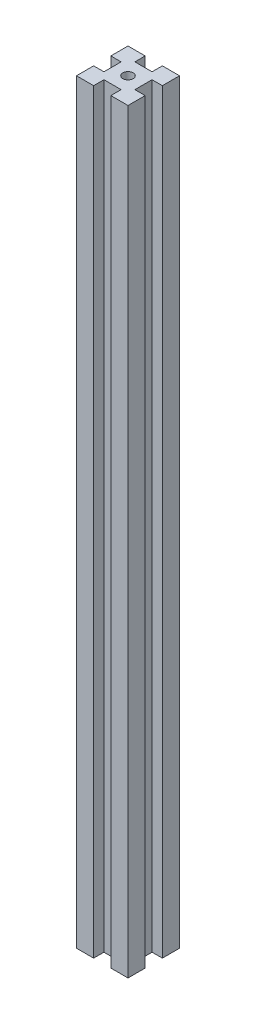
ISO-10303-21;
HEADER;
FILE_DESCRIPTION(('STEP AP214'),'2;1');
FILE_NAME('part.step','',(''),(''),'','','');
FILE_SCHEMA(('AUTOMOTIVE_DESIGN { 1 0 10303 214 1 1 1 1 }'));
ENDSEC;
DATA;
#1=APPLICATION_CONTEXT('core data for automotive mechanical design processes');
#2=APPLICATION_PROTOCOL_DEFINITION('international standard','automotive_design',2000,#1);
#3=PRODUCT_CONTEXT('',#1,'mechanical');
#4=PRODUCT('Part','Part','',(#3));
#5=PRODUCT_RELATED_PRODUCT_CATEGORY('part','',(#4));
#6=PRODUCT_DEFINITION_FORMATION('','',#4);
#7=PRODUCT_DEFINITION_CONTEXT('part definition',#1,'design');
#8=PRODUCT_DEFINITION('design','',#6,#7);
#9=PRODUCT_DEFINITION_SHAPE('','',#8);
#10=(LENGTH_UNIT() NAMED_UNIT(*) SI_UNIT(.MILLI.,.METRE.));
#11=(NAMED_UNIT(*) PLANE_ANGLE_UNIT() SI_UNIT($,.RADIAN.));
#12=(NAMED_UNIT(*) SI_UNIT($,.STERADIAN.) SOLID_ANGLE_UNIT());
#13=UNCERTAINTY_MEASURE_WITH_UNIT(LENGTH_MEASURE(1.E-05),#10,'distance_accuracy_value','');
#14=(GEOMETRIC_REPRESENTATION_CONTEXT(3) GLOBAL_UNCERTAINTY_ASSIGNED_CONTEXT((#13)) GLOBAL_UNIT_ASSIGNED_CONTEXT((#10,
#11,#12)) REPRESENTATION_CONTEXT('',''));
#15=CARTESIAN_POINT('',(0.,0.,0.));
#16=DIRECTION('',(0.,0.,1.));
#17=DIRECTION('',(1.,0.,0.));
#18=AXIS2_PLACEMENT_3D('',#15,#16,#17);
#19=CARTESIAN_POINT('',(0.,220.,0.));
#20=DIRECTION('',(0.,1.,0.));
#21=DIRECTION('',(0.,0.,1.));
#22=AXIS2_PLACEMENT_3D('',#19,#20,#21);
#23=PLANE('',#22);
#24=DIRECTION('',(-1.,0.,0.));
#25=VECTOR('',#24,1.);
#26=CARTESIAN_POINT('',(2.50000000000001,220.,-7.5));
#27=LINE('',#26,#25);
#28=CARTESIAN_POINT('',(7.5,220.,-7.5));
#29=VERTEX_POINT('',#28);
#30=CARTESIAN_POINT('',(2.50000000000001,220.,-7.5));
#31=VERTEX_POINT('',#30);
#32=EDGE_CURVE('E272',#29,#31,#27,.T.);
#33=ORIENTED_EDGE('',*,*,#32,.T.);
#34=DIRECTION('',(0.,0.,1.));
#35=VECTOR('',#34,1.);
#36=CARTESIAN_POINT('',(2.50000000000001,220.,-4.5));
#37=LINE('',#36,#35);
#38=CARTESIAN_POINT('',(2.50000000000001,220.,-4.5));
#39=VERTEX_POINT('',#38);
#40=EDGE_CURVE('E136',#31,#39,#37,.T.);
#41=ORIENTED_EDGE('',*,*,#40,.T.);
#42=DIRECTION('',(-1.,0.,0.));
#43=VECTOR('',#42,1.);
#44=CARTESIAN_POINT('',(-2.5,220.,-4.5));
#45=LINE('',#44,#43);
#46=CARTESIAN_POINT('',(-2.5,220.,-4.5));
#47=VERTEX_POINT('',#46);
#48=EDGE_CURVE('E341',#39,#47,#45,.T.);
#49=ORIENTED_EDGE('',*,*,#48,.T.);
#50=DIRECTION('',(0.,0.,-1.));
#51=VECTOR('',#50,1.);
#52=CARTESIAN_POINT('',(-2.5,220.,-7.5));
#53=LINE('',#52,#51);
#54=CARTESIAN_POINT('',(-2.5,220.,-7.5));
#55=VERTEX_POINT('',#54);
#56=EDGE_CURVE('E361',#47,#55,#53,.T.);
#57=ORIENTED_EDGE('',*,*,#56,.T.);
#58=DIRECTION('',(-1.,0.,0.));
#59=VECTOR('',#58,1.);
#60=CARTESIAN_POINT('',(-7.5,220.,-7.5));
#61=LINE('',#60,#59);
#62=CARTESIAN_POINT('',(-7.5,220.,-7.5));
#63=VERTEX_POINT('',#62);
#64=EDGE_CURVE('E357',#55,#63,#61,.T.);
#65=ORIENTED_EDGE('',*,*,#64,.T.);
#66=DIRECTION('',(0.,0.,1.));
#67=VECTOR('',#66,1.);
#68=CARTESIAN_POINT('',(-7.5,220.,-2.5));
#69=LINE('',#68,#67);
#70=CARTESIAN_POINT('',(-7.5,220.,-2.5));
#71=VERTEX_POINT('',#70);
#72=EDGE_CURVE('E360',#63,#71,#69,.T.);
#73=ORIENTED_EDGE('',*,*,#72,.T.);
#74=DIRECTION('',(1.,0.,0.));
#75=VECTOR('',#74,1.);
#76=CARTESIAN_POINT('',(-7.5,220.,-2.5));
#77=LINE('',#76,#75);
#78=CARTESIAN_POINT('',(-4.5,220.,-2.5));
#79=VERTEX_POINT('',#78);
#80=EDGE_CURVE('E365',#71,#79,#77,.T.);
#81=ORIENTED_EDGE('',*,*,#80,.T.);
#82=DIRECTION('',(0.,0.,1.));
#83=VECTOR('',#82,1.);
#84=CARTESIAN_POINT('',(-4.5,220.,-2.5));
#85=LINE('',#84,#83);
#86=CARTESIAN_POINT('',(-4.5,220.,2.5));
#87=VERTEX_POINT('',#86);
#88=EDGE_CURVE('E372',#79,#87,#85,.T.);
#89=ORIENTED_EDGE('',*,*,#88,.T.);
#90=DIRECTION('',(-1.,0.,0.));
#91=VECTOR('',#90,1.);
#92=CARTESIAN_POINT('',(-4.5,220.,2.5));
#93=LINE('',#92,#91);
#94=CARTESIAN_POINT('',(-7.5,220.,2.5));
#95=VERTEX_POINT('',#94);
#96=EDGE_CURVE('E375',#87,#95,#93,.T.);
#97=ORIENTED_EDGE('',*,*,#96,.T.);
#98=DIRECTION('',(0.,0.,1.));
#99=VECTOR('',#98,1.);
#100=CARTESIAN_POINT('',(-7.5,220.,7.5));
#101=LINE('',#100,#99);
#102=CARTESIAN_POINT('',(-7.5,220.,7.5));
#103=VERTEX_POINT('',#102);
#104=EDGE_CURVE('E378',#95,#103,#101,.T.);
#105=ORIENTED_EDGE('',*,*,#104,.T.);
#106=DIRECTION('',(1.,0.,0.));
#107=VECTOR('',#106,1.);
#108=CARTESIAN_POINT('',(-7.5,220.,7.5));
#109=LINE('',#108,#107);
#110=CARTESIAN_POINT('',(-2.5,220.,7.5));
#111=VERTEX_POINT('',#110);
#112=EDGE_CURVE('E381',#103,#111,#109,.T.);
#113=ORIENTED_EDGE('',*,*,#112,.T.);
#114=DIRECTION('',(0.,0.,-1.));
#115=VECTOR('',#114,1.);
#116=CARTESIAN_POINT('',(-2.5,220.,7.5));
#117=LINE('',#116,#115);
#118=CARTESIAN_POINT('',(-2.5,220.,4.5));
#119=VERTEX_POINT('',#118);
#120=EDGE_CURVE('E384',#111,#119,#117,.T.);
#121=ORIENTED_EDGE('',*,*,#120,.T.);
#122=DIRECTION('',(1.,0.,0.));
#123=VECTOR('',#122,1.);
#124=CARTESIAN_POINT('',(-2.5,220.,4.5));
#125=LINE('',#124,#123);
#126=CARTESIAN_POINT('',(2.5,220.,4.5));
#127=VERTEX_POINT('',#126);
#128=EDGE_CURVE('E387',#119,#127,#125,.T.);
#129=ORIENTED_EDGE('',*,*,#128,.T.);
#130=DIRECTION('',(0.,0.,1.));
#131=VECTOR('',#130,1.);
#132=CARTESIAN_POINT('',(2.5,220.,4.5));
#133=LINE('',#132,#131);
#134=CARTESIAN_POINT('',(2.5,220.,7.5));
#135=VERTEX_POINT('',#134);
#136=EDGE_CURVE('E390',#127,#135,#133,.T.);
#137=ORIENTED_EDGE('',*,*,#136,.T.);
#138=DIRECTION('',(1.,0.,0.));
#139=VECTOR('',#138,1.);
#140=CARTESIAN_POINT('',(2.5,220.,7.5));
#141=LINE('',#140,#139);
#142=CARTESIAN_POINT('',(7.5,220.,7.5));
#143=VERTEX_POINT('',#142);
#144=EDGE_CURVE('E393',#135,#143,#141,.T.);
#145=ORIENTED_EDGE('',*,*,#144,.T.);
#146=DIRECTION('',(0.,0.,-1.));
#147=VECTOR('',#146,1.);
#148=CARTESIAN_POINT('',(7.5,220.,7.5));
#149=LINE('',#148,#147);
#150=CARTESIAN_POINT('',(7.5,220.,2.5));
#151=VERTEX_POINT('',#150);
#152=EDGE_CURVE('E396',#143,#151,#149,.T.);
#153=ORIENTED_EDGE('',*,*,#152,.T.);
#154=DIRECTION('',(-1.,0.,0.));
#155=VECTOR('',#154,1.);
#156=CARTESIAN_POINT('',(4.49999999999999,220.,2.5));
#157=LINE('',#156,#155);
#158=CARTESIAN_POINT('',(4.49999999999999,220.,2.5));
#159=VERTEX_POINT('',#158);
#160=EDGE_CURVE('E191',#151,#159,#157,.T.);
#161=ORIENTED_EDGE('',*,*,#160,.T.);
#162=DIRECTION('',(0.,0.,-1.));
#163=VECTOR('',#162,1.);
#164=CARTESIAN_POINT('',(4.5,220.,-2.5));
#165=LINE('',#164,#163);
#166=CARTESIAN_POINT('',(4.5,220.,-2.5));
#167=VERTEX_POINT('',#166);
#168=EDGE_CURVE('E185',#159,#167,#165,.T.);
#169=ORIENTED_EDGE('',*,*,#168,.T.);
#170=DIRECTION('',(1.,0.,0.));
#171=VECTOR('',#170,1.);
#172=CARTESIAN_POINT('',(7.5,220.,-2.5));
#173=LINE('',#172,#171);
#174=CARTESIAN_POINT('',(7.5,220.,-2.5));
#175=VERTEX_POINT('',#174);
#176=EDGE_CURVE('E189',#167,#175,#173,.T.);
#177=ORIENTED_EDGE('',*,*,#176,.T.);
#178=DIRECTION('',(0.,0.,-1.));
#179=VECTOR('',#178,1.);
#180=CARTESIAN_POINT('',(7.5,220.,-2.5));
#181=LINE('',#180,#179);
#182=EDGE_CURVE('E57',#175,#29,#181,.T.);
#183=ORIENTED_EDGE('',*,*,#182,.T.);
#184=EDGE_LOOP('',(#33,#41,#49,#57,#65,#73,#81,#89,#97,#105,#113,#121,#129,#137,#145,#153,#161,
#169,#177,#183));
#185=FACE_BOUND('',#184,.T.);
#186=CARTESIAN_POINT('',(0.,220.,0.));
#187=DIRECTION('',(0.,1.,0.));
#188=DIRECTION('',(0.,0.,1.));
#189=AXIS2_PLACEMENT_3D('',#186,#187,#188);
#190=CIRCLE('',#189,1.5);
#191=CARTESIAN_POINT('',(0.,220.,1.5));
#192=VERTEX_POINT('',#191);
#193=EDGE_CURVE('E218',#192,#192,#190,.T.);
#194=ORIENTED_EDGE('',*,*,#193,.F.);
#195=EDGE_LOOP('',(#194));
#196=FACE_BOUND('',#195,.T.);
#197=ADVANCED_FACE('F39',(#185,#196),#23,.T.);
#198=CARTESIAN_POINT('',(0.,0.,0.));
#199=DIRECTION('',(0.,1.,0.));
#200=DIRECTION('',(0.,0.,1.));
#201=AXIS2_PLACEMENT_3D('',#198,#199,#200);
#202=PLANE('',#201);
#203=DIRECTION('',(-1.,0.,0.));
#204=VECTOR('',#203,1.);
#205=CARTESIAN_POINT('',(2.50000000000001,0.,-7.5));
#206=LINE('',#205,#204);
#207=CARTESIAN_POINT('',(7.5,0.,-7.5));
#208=VERTEX_POINT('',#207);
#209=CARTESIAN_POINT('',(2.50000000000001,0.,-7.5));
#210=VERTEX_POINT('',#209);
#211=EDGE_CURVE('E213',#208,#210,#206,.T.);
#212=ORIENTED_EDGE('',*,*,#211,.F.);
#213=DIRECTION('',(0.,0.,-1.));
#214=VECTOR('',#213,1.);
#215=CARTESIAN_POINT('',(7.5,0.,-2.5));
#216=LINE('',#215,#214);
#217=CARTESIAN_POINT('',(7.5,0.,-2.5));
#218=VERTEX_POINT('',#217);
#219=EDGE_CURVE('E128',#218,#208,#216,.T.);
#220=ORIENTED_EDGE('',*,*,#219,.F.);
#221=DIRECTION('',(1.,0.,0.));
#222=VECTOR('',#221,1.);
#223=CARTESIAN_POINT('',(7.5,0.,-2.5));
#224=LINE('',#223,#222);
#225=CARTESIAN_POINT('',(4.5,0.,-2.5));
#226=VERTEX_POINT('',#225);
#227=EDGE_CURVE('E122',#226,#218,#224,.T.);
#228=ORIENTED_EDGE('',*,*,#227,.F.);
#229=DIRECTION('',(0.,0.,-1.));
#230=VECTOR('',#229,1.);
#231=CARTESIAN_POINT('',(4.5,0.,-2.5));
#232=LINE('',#231,#230);
#233=CARTESIAN_POINT('',(4.49999999999999,0.,2.5));
#234=VERTEX_POINT('',#233);
#235=EDGE_CURVE('E200',#234,#226,#232,.T.);
#236=ORIENTED_EDGE('',*,*,#235,.F.);
#237=DIRECTION('',(-1.,0.,0.));
#238=VECTOR('',#237,1.);
#239=CARTESIAN_POINT('',(4.49999999999999,0.,2.5));
#240=LINE('',#239,#238);
#241=CARTESIAN_POINT('',(7.5,0.,2.5));
#242=VERTEX_POINT('',#241);
#243=EDGE_CURVE('E263',#242,#234,#240,.T.);
#244=ORIENTED_EDGE('',*,*,#243,.F.);
#245=DIRECTION('',(0.,0.,-1.));
#246=VECTOR('',#245,1.);
#247=CARTESIAN_POINT('',(7.5,0.,7.5));
#248=LINE('',#247,#246);
#249=CARTESIAN_POINT('',(7.5,0.,7.5));
#250=VERTEX_POINT('',#249);
#251=EDGE_CURVE('E260',#250,#242,#248,.T.);
#252=ORIENTED_EDGE('',*,*,#251,.F.);
#253=DIRECTION('',(1.,0.,0.));
#254=VECTOR('',#253,1.);
#255=CARTESIAN_POINT('',(2.5,0.,7.5));
#256=LINE('',#255,#254);
#257=CARTESIAN_POINT('',(2.5,0.,7.5));
#258=VERTEX_POINT('',#257);
#259=EDGE_CURVE('E257',#258,#250,#256,.T.);
#260=ORIENTED_EDGE('',*,*,#259,.F.);
#261=DIRECTION('',(0.,0.,1.));
#262=VECTOR('',#261,1.);
#263=CARTESIAN_POINT('',(2.5,0.,4.5));
#264=LINE('',#263,#262);
#265=CARTESIAN_POINT('',(2.5,0.,4.5));
#266=VERTEX_POINT('',#265);
#267=EDGE_CURVE('E254',#266,#258,#264,.T.);
#268=ORIENTED_EDGE('',*,*,#267,.F.);
#269=DIRECTION('',(1.,0.,0.));
#270=VECTOR('',#269,1.);
#271=CARTESIAN_POINT('',(-2.5,0.,4.5));
#272=LINE('',#271,#270);
#273=CARTESIAN_POINT('',(-2.5,0.,4.5));
#274=VERTEX_POINT('',#273);
#275=EDGE_CURVE('E251',#274,#266,#272,.T.);
#276=ORIENTED_EDGE('',*,*,#275,.F.);
#277=DIRECTION('',(0.,0.,-1.));
#278=VECTOR('',#277,1.);
#279=CARTESIAN_POINT('',(-2.5,0.,7.5));
#280=LINE('',#279,#278);
#281=CARTESIAN_POINT('',(-2.5,0.,7.5));
#282=VERTEX_POINT('',#281);
#283=EDGE_CURVE('E248',#282,#274,#280,.T.);
#284=ORIENTED_EDGE('',*,*,#283,.F.);
#285=DIRECTION('',(1.,0.,0.));
#286=VECTOR('',#285,1.);
#287=CARTESIAN_POINT('',(-7.5,0.,7.5));
#288=LINE('',#287,#286);
#289=CARTESIAN_POINT('',(-7.5,0.,7.5));
#290=VERTEX_POINT('',#289);
#291=EDGE_CURVE('E245',#290,#282,#288,.T.);
#292=ORIENTED_EDGE('',*,*,#291,.F.);
#293=DIRECTION('',(0.,0.,1.));
#294=VECTOR('',#293,1.);
#295=CARTESIAN_POINT('',(-7.5,0.,7.5));
#296=LINE('',#295,#294);
#297=CARTESIAN_POINT('',(-7.5,0.,2.5));
#298=VERTEX_POINT('',#297);
#299=EDGE_CURVE('E242',#298,#290,#296,.T.);
#300=ORIENTED_EDGE('',*,*,#299,.F.);
#301=DIRECTION('',(-1.,0.,0.));
#302=VECTOR('',#301,1.);
#303=CARTESIAN_POINT('',(-4.5,0.,2.5));
#304=LINE('',#303,#302);
#305=CARTESIAN_POINT('',(-4.5,0.,2.5));
#306=VERTEX_POINT('',#305);
#307=EDGE_CURVE('E239',#306,#298,#304,.T.);
#308=ORIENTED_EDGE('',*,*,#307,.F.);
#309=DIRECTION('',(0.,0.,1.));
#310=VECTOR('',#309,1.);
#311=CARTESIAN_POINT('',(-4.5,0.,-2.5));
#312=LINE('',#311,#310);
#313=CARTESIAN_POINT('',(-4.5,0.,-2.5));
#314=VERTEX_POINT('',#313);
#315=EDGE_CURVE('E236',#314,#306,#312,.T.);
#316=ORIENTED_EDGE('',*,*,#315,.F.);
#317=DIRECTION('',(1.,0.,0.));
#318=VECTOR('',#317,1.);
#319=CARTESIAN_POINT('',(-7.5,0.,-2.5));
#320=LINE('',#319,#318);
#321=CARTESIAN_POINT('',(-7.5,0.,-2.5));
#322=VERTEX_POINT('',#321);
#323=EDGE_CURVE('E233',#322,#314,#320,.T.);
#324=ORIENTED_EDGE('',*,*,#323,.F.);
#325=DIRECTION('',(0.,0.,1.));
#326=VECTOR('',#325,1.);
#327=CARTESIAN_POINT('',(-7.5,0.,-2.5));
#328=LINE('',#327,#326);
#329=CARTESIAN_POINT('',(-7.5,0.,-7.5));
#330=VERTEX_POINT('',#329);
#331=EDGE_CURVE('E230',#330,#322,#328,.T.);
#332=ORIENTED_EDGE('',*,*,#331,.F.);
#333=DIRECTION('',(-1.,0.,0.));
#334=VECTOR('',#333,1.);
#335=CARTESIAN_POINT('',(-7.5,0.,-7.5));
#336=LINE('',#335,#334);
#337=CARTESIAN_POINT('',(-2.5,0.,-7.5));
#338=VERTEX_POINT('',#337);
#339=EDGE_CURVE('E227',#338,#330,#336,.T.);
#340=ORIENTED_EDGE('',*,*,#339,.F.);
#341=DIRECTION('',(0.,0.,-1.));
#342=VECTOR('',#341,1.);
#343=CARTESIAN_POINT('',(-2.5,0.,-7.5));
#344=LINE('',#343,#342);
#345=CARTESIAN_POINT('',(-2.5,0.,-4.5));
#346=VERTEX_POINT('',#345);
#347=EDGE_CURVE('E224',#346,#338,#344,.T.);
#348=ORIENTED_EDGE('',*,*,#347,.F.);
#349=DIRECTION('',(-1.,0.,0.));
#350=VECTOR('',#349,1.);
#351=CARTESIAN_POINT('',(-2.5,0.,-4.5));
#352=LINE('',#351,#350);
#353=CARTESIAN_POINT('',(2.50000000000001,0.,-4.5));
#354=VERTEX_POINT('',#353);
#355=EDGE_CURVE('E221',#354,#346,#352,.T.);
#356=ORIENTED_EDGE('',*,*,#355,.F.);
#357=DIRECTION('',(0.,0.,1.));
#358=VECTOR('',#357,1.);
#359=CARTESIAN_POINT('',(2.50000000000001,0.,-4.5));
#360=LINE('',#359,#358);
#361=EDGE_CURVE('E217',#210,#354,#360,.T.);
#362=ORIENTED_EDGE('',*,*,#361,.F.);
#363=EDGE_LOOP('',(#212,#220,#228,#236,#244,#252,#260,#268,#276,#284,#292,#300,#308,#316,#324,
#332,#340,#348,#356,#362));
#364=FACE_BOUND('',#363,.T.);
#365=CARTESIAN_POINT('',(0.,0.,0.));
#366=DIRECTION('',(0.,1.,0.));
#367=DIRECTION('',(0.,0.,1.));
#368=AXIS2_PLACEMENT_3D('',#365,#366,#367);
#369=CIRCLE('',#368,1.5);
#370=CARTESIAN_POINT('',(0.,0.,1.5));
#371=VERTEX_POINT('',#370);
#372=EDGE_CURVE('E649',#371,#371,#369,.T.);
#373=ORIENTED_EDGE('',*,*,#372,.T.);
#374=EDGE_LOOP('',(#373));
#375=FACE_BOUND('',#374,.T.);
#376=ADVANCED_FACE('F345',(#364,#375),#202,.F.);
#377=CARTESIAN_POINT('',(2.50000000000001,220.,-7.5));
#378=DIRECTION('',(0.,0.,1.));
#379=DIRECTION('',(1.,0.,0.));
#380=AXIS2_PLACEMENT_3D('',#377,#378,#379);
#381=PLANE('',#380);
#382=ORIENTED_EDGE('',*,*,#211,.T.);
#383=DIRECTION('',(0.,-1.,0.));
#384=VECTOR('',#383,1.);
#385=CARTESIAN_POINT('',(2.50000000000001,220.,-7.5));
#386=LINE('',#385,#384);
#387=EDGE_CURVE('E11',#31,#210,#386,.T.);
#388=ORIENTED_EDGE('',*,*,#387,.F.);
#389=ORIENTED_EDGE('',*,*,#32,.F.);
#390=DIRECTION('',(0.,-1.,0.));
#391=VECTOR('',#390,1.);
#392=CARTESIAN_POINT('',(7.5,220.,-7.5));
#393=LINE('',#392,#391);
#394=EDGE_CURVE('E209',#29,#208,#393,.T.);
#395=ORIENTED_EDGE('',*,*,#394,.T.);
#396=EDGE_LOOP('',(#382,#388,#389,#395));
#397=FACE_BOUND('',#396,.T.);
#398=ADVANCED_FACE('F41',(#397),#381,.F.);
#399=CARTESIAN_POINT('',(2.50000000000001,220.,-4.5));
#400=DIRECTION('',(1.,0.,0.));
#401=DIRECTION('',(0.,0.,-1.));
#402=AXIS2_PLACEMENT_3D('',#399,#400,#401);
#403=PLANE('',#402);
#404=ORIENTED_EDGE('',*,*,#361,.T.);
#405=DIRECTION('',(0.,-1.,0.));
#406=VECTOR('',#405,1.);
#407=CARTESIAN_POINT('',(2.50000000000001,220.,-4.5));
#408=LINE('',#407,#406);
#409=EDGE_CURVE('E49',#39,#354,#408,.T.);
#410=ORIENTED_EDGE('',*,*,#409,.F.);
#411=ORIENTED_EDGE('',*,*,#40,.F.);
#412=ORIENTED_EDGE('',*,*,#387,.T.);
#413=EDGE_LOOP('',(#404,#410,#411,#412));
#414=FACE_BOUND('',#413,.T.);
#415=ADVANCED_FACE('F432',(#414),#403,.F.);
#416=CARTESIAN_POINT('',(-2.5,220.,-4.5));
#417=DIRECTION('',(0.,0.,1.));
#418=DIRECTION('',(1.,0.,0.));
#419=AXIS2_PLACEMENT_3D('',#416,#417,#418);
#420=PLANE('',#419);
#421=ORIENTED_EDGE('',*,*,#355,.T.);
#422=DIRECTION('',(0.,-1.,0.));
#423=VECTOR('',#422,1.);
#424=CARTESIAN_POINT('',(-2.5,220.,-4.5));
#425=LINE('',#424,#423);
#426=EDGE_CURVE('E331',#47,#346,#425,.T.);
#427=ORIENTED_EDGE('',*,*,#426,.F.);
#428=ORIENTED_EDGE('',*,*,#48,.F.);
#429=ORIENTED_EDGE('',*,*,#409,.T.);
#430=EDGE_LOOP('',(#421,#427,#428,#429));
#431=FACE_BOUND('',#430,.T.);
#432=ADVANCED_FACE('F339',(#431),#420,.F.);
#433=CARTESIAN_POINT('',(-2.5,220.,-7.5));
#434=DIRECTION('',(-1.,0.,0.));
#435=DIRECTION('',(0.,0.,1.));
#436=AXIS2_PLACEMENT_3D('',#433,#434,#435);
#437=PLANE('',#436);
#438=ORIENTED_EDGE('',*,*,#347,.T.);
#439=DIRECTION('',(0.,-1.,0.));
#440=VECTOR('',#439,1.);
#441=CARTESIAN_POINT('',(-2.5,220.,-7.5));
#442=LINE('',#441,#440);
#443=EDGE_CURVE('E327',#55,#338,#442,.T.);
#444=ORIENTED_EDGE('',*,*,#443,.F.);
#445=ORIENTED_EDGE('',*,*,#56,.F.);
#446=ORIENTED_EDGE('',*,*,#426,.T.);
#447=EDGE_LOOP('',(#438,#444,#445,#446));
#448=FACE_BOUND('',#447,.T.);
#449=ADVANCED_FACE('F351',(#448),#437,.F.);
#450=CARTESIAN_POINT('',(-7.5,220.,-7.5));
#451=DIRECTION('',(0.,0.,1.));
#452=DIRECTION('',(1.,0.,0.));
#453=AXIS2_PLACEMENT_3D('',#450,#451,#452);
#454=PLANE('',#453);
#455=ORIENTED_EDGE('',*,*,#339,.T.);
#456=DIRECTION('',(0.,-1.,0.));
#457=VECTOR('',#456,1.);
#458=CARTESIAN_POINT('',(-7.5,220.,-7.5));
#459=LINE('',#458,#457);
#460=EDGE_CURVE('E323',#63,#330,#459,.T.);
#461=ORIENTED_EDGE('',*,*,#460,.F.);
#462=ORIENTED_EDGE('',*,*,#64,.F.);
#463=ORIENTED_EDGE('',*,*,#443,.T.);
#464=EDGE_LOOP('',(#455,#461,#462,#463));
#465=FACE_BOUND('',#464,.T.);
#466=ADVANCED_FACE('F355',(#465),#454,.F.);
#467=CARTESIAN_POINT('',(-7.5,220.,-2.5));
#468=DIRECTION('',(1.,0.,0.));
#469=DIRECTION('',(0.,0.,-1.));
#470=AXIS2_PLACEMENT_3D('',#467,#468,#469);
#471=PLANE('',#470);
#472=ORIENTED_EDGE('',*,*,#331,.T.);
#473=DIRECTION('',(0.,-1.,0.));
#474=VECTOR('',#473,1.);
#475=CARTESIAN_POINT('',(-7.5,220.,-2.5));
#476=LINE('',#475,#474);
#477=EDGE_CURVE('E319',#71,#322,#476,.T.);
#478=ORIENTED_EDGE('',*,*,#477,.F.);
#479=ORIENTED_EDGE('',*,*,#72,.F.);
#480=ORIENTED_EDGE('',*,*,#460,.T.);
#481=EDGE_LOOP('',(#472,#478,#479,#480));
#482=FACE_BOUND('',#481,.T.);
#483=ADVANCED_FACE('F445',(#482),#471,.F.);
#484=CARTESIAN_POINT('',(-7.5,220.,-2.5));
#485=DIRECTION('',(0.,0.,-1.));
#486=DIRECTION('',(-1.,0.,0.));
#487=AXIS2_PLACEMENT_3D('',#484,#485,#486);
#488=PLANE('',#487);
#489=ORIENTED_EDGE('',*,*,#323,.T.);
#490=DIRECTION('',(0.,-1.,0.));
#491=VECTOR('',#490,1.);
#492=CARTESIAN_POINT('',(-4.5,220.,-2.5));
#493=LINE('',#492,#491);
#494=EDGE_CURVE('E315',#79,#314,#493,.T.);
#495=ORIENTED_EDGE('',*,*,#494,.F.);
#496=ORIENTED_EDGE('',*,*,#80,.F.);
#497=ORIENTED_EDGE('',*,*,#477,.T.);
#498=EDGE_LOOP('',(#489,#495,#496,#497));
#499=FACE_BOUND('',#498,.T.);
#500=ADVANCED_FACE('F448',(#499),#488,.F.);
#501=CARTESIAN_POINT('',(-4.5,220.,-2.5));
#502=DIRECTION('',(1.,0.,0.));
#503=DIRECTION('',(0.,0.,-1.));
#504=AXIS2_PLACEMENT_3D('',#501,#502,#503);
#505=PLANE('',#504);
#506=ORIENTED_EDGE('',*,*,#315,.T.);
#507=DIRECTION('',(0.,-1.,0.));
#508=VECTOR('',#507,1.);
#509=CARTESIAN_POINT('',(-4.5,220.,2.5));
#510=LINE('',#509,#508);
#511=EDGE_CURVE('E311',#87,#306,#510,.T.);
#512=ORIENTED_EDGE('',*,*,#511,.F.);
#513=ORIENTED_EDGE('',*,*,#88,.F.);
#514=ORIENTED_EDGE('',*,*,#494,.T.);
#515=EDGE_LOOP('',(#506,#512,#513,#514));
#516=FACE_BOUND('',#515,.T.);
#517=ADVANCED_FACE('F452',(#516),#505,.F.);
#518=CARTESIAN_POINT('',(-4.5,220.,2.5));
#519=DIRECTION('',(0.,0.,1.));
#520=DIRECTION('',(1.,0.,0.));
#521=AXIS2_PLACEMENT_3D('',#518,#519,#520);
#522=PLANE('',#521);
#523=ORIENTED_EDGE('',*,*,#307,.T.);
#524=DIRECTION('',(0.,-1.,0.));
#525=VECTOR('',#524,1.);
#526=CARTESIAN_POINT('',(-7.5,220.,2.5));
#527=LINE('',#526,#525);
#528=EDGE_CURVE('E307',#95,#298,#527,.T.);
#529=ORIENTED_EDGE('',*,*,#528,.F.);
#530=ORIENTED_EDGE('',*,*,#96,.F.);
#531=ORIENTED_EDGE('',*,*,#511,.T.);
#532=EDGE_LOOP('',(#523,#529,#530,#531));
#533=FACE_BOUND('',#532,.T.);
#534=ADVANCED_FACE('F456',(#533),#522,.F.);
#535=CARTESIAN_POINT('',(-7.5,220.,7.5));
#536=DIRECTION('',(1.,0.,0.));
#537=DIRECTION('',(0.,0.,-1.));
#538=AXIS2_PLACEMENT_3D('',#535,#536,#537);
#539=PLANE('',#538);
#540=ORIENTED_EDGE('',*,*,#299,.T.);
#541=DIRECTION('',(0.,-1.,0.));
#542=VECTOR('',#541,1.);
#543=CARTESIAN_POINT('',(-7.5,220.,7.5));
#544=LINE('',#543,#542);
#545=EDGE_CURVE('E303',#103,#290,#544,.T.);
#546=ORIENTED_EDGE('',*,*,#545,.F.);
#547=ORIENTED_EDGE('',*,*,#104,.F.);
#548=ORIENTED_EDGE('',*,*,#528,.T.);
#549=EDGE_LOOP('',(#540,#546,#547,#548));
#550=FACE_BOUND('',#549,.T.);
#551=ADVANCED_FACE('F460',(#550),#539,.F.);
#552=CARTESIAN_POINT('',(-7.5,220.,7.5));
#553=DIRECTION('',(0.,0.,-1.));
#554=DIRECTION('',(-1.,0.,0.));
#555=AXIS2_PLACEMENT_3D('',#552,#553,#554);
#556=PLANE('',#555);
#557=ORIENTED_EDGE('',*,*,#291,.T.);
#558=DIRECTION('',(0.,-1.,0.));
#559=VECTOR('',#558,1.);
#560=CARTESIAN_POINT('',(-2.5,220.,7.5));
#561=LINE('',#560,#559);
#562=EDGE_CURVE('E299',#111,#282,#561,.T.);
#563=ORIENTED_EDGE('',*,*,#562,.F.);
#564=ORIENTED_EDGE('',*,*,#112,.F.);
#565=ORIENTED_EDGE('',*,*,#545,.T.);
#566=EDGE_LOOP('',(#557,#563,#564,#565));
#567=FACE_BOUND('',#566,.T.);
#568=ADVANCED_FACE('F464',(#567),#556,.F.);
#569=CARTESIAN_POINT('',(-2.5,220.,7.5));
#570=DIRECTION('',(-1.,0.,0.));
#571=DIRECTION('',(0.,0.,1.));
#572=AXIS2_PLACEMENT_3D('',#569,#570,#571);
#573=PLANE('',#572);
#574=ORIENTED_EDGE('',*,*,#283,.T.);
#575=DIRECTION('',(0.,-1.,0.));
#576=VECTOR('',#575,1.);
#577=CARTESIAN_POINT('',(-2.5,220.,4.5));
#578=LINE('',#577,#576);
#579=EDGE_CURVE('E295',#119,#274,#578,.T.);
#580=ORIENTED_EDGE('',*,*,#579,.F.);
#581=ORIENTED_EDGE('',*,*,#120,.F.);
#582=ORIENTED_EDGE('',*,*,#562,.T.);
#583=EDGE_LOOP('',(#574,#580,#581,#582));
#584=FACE_BOUND('',#583,.T.);
#585=ADVANCED_FACE('F468',(#584),#573,.F.);
#586=CARTESIAN_POINT('',(-2.5,220.,4.5));
#587=DIRECTION('',(0.,0.,-1.));
#588=DIRECTION('',(-1.,0.,0.));
#589=AXIS2_PLACEMENT_3D('',#586,#587,#588);
#590=PLANE('',#589);
#591=ORIENTED_EDGE('',*,*,#275,.T.);
#592=DIRECTION('',(0.,-1.,0.));
#593=VECTOR('',#592,1.);
#594=CARTESIAN_POINT('',(2.5,220.,4.5));
#595=LINE('',#594,#593);
#596=EDGE_CURVE('E291',#127,#266,#595,.T.);
#597=ORIENTED_EDGE('',*,*,#596,.F.);
#598=ORIENTED_EDGE('',*,*,#128,.F.);
#599=ORIENTED_EDGE('',*,*,#579,.T.);
#600=EDGE_LOOP('',(#591,#597,#598,#599));
#601=FACE_BOUND('',#600,.T.);
#602=ADVANCED_FACE('F472',(#601),#590,.F.);
#603=CARTESIAN_POINT('',(2.5,220.,4.5));
#604=DIRECTION('',(1.,0.,0.));
#605=DIRECTION('',(0.,0.,-1.));
#606=AXIS2_PLACEMENT_3D('',#603,#604,#605);
#607=PLANE('',#606);
#608=ORIENTED_EDGE('',*,*,#267,.T.);
#609=DIRECTION('',(0.,-1.,0.));
#610=VECTOR('',#609,1.);
#611=CARTESIAN_POINT('',(2.5,220.,7.5));
#612=LINE('',#611,#610);
#613=EDGE_CURVE('E287',#135,#258,#612,.T.);
#614=ORIENTED_EDGE('',*,*,#613,.F.);
#615=ORIENTED_EDGE('',*,*,#136,.F.);
#616=ORIENTED_EDGE('',*,*,#596,.T.);
#617=EDGE_LOOP('',(#608,#614,#615,#616));
#618=FACE_BOUND('',#617,.T.);
#619=ADVANCED_FACE('F476',(#618),#607,.F.);
#620=CARTESIAN_POINT('',(2.5,220.,7.5));
#621=DIRECTION('',(0.,0.,-1.));
#622=DIRECTION('',(-1.,0.,0.));
#623=AXIS2_PLACEMENT_3D('',#620,#621,#622);
#624=PLANE('',#623);
#625=ORIENTED_EDGE('',*,*,#259,.T.);
#626=DIRECTION('',(0.,-1.,0.));
#627=VECTOR('',#626,1.);
#628=CARTESIAN_POINT('',(7.5,220.,7.5));
#629=LINE('',#628,#627);
#630=EDGE_CURVE('E283',#143,#250,#629,.T.);
#631=ORIENTED_EDGE('',*,*,#630,.F.);
#632=ORIENTED_EDGE('',*,*,#144,.F.);
#633=ORIENTED_EDGE('',*,*,#613,.T.);
#634=EDGE_LOOP('',(#625,#631,#632,#633));
#635=FACE_BOUND('',#634,.T.);
#636=ADVANCED_FACE('F480',(#635),#624,.F.);
#637=CARTESIAN_POINT('',(7.5,220.,7.5));
#638=DIRECTION('',(-1.,0.,0.));
#639=DIRECTION('',(0.,0.,1.));
#640=AXIS2_PLACEMENT_3D('',#637,#638,#639);
#641=PLANE('',#640);
#642=ORIENTED_EDGE('',*,*,#251,.T.);
#643=DIRECTION('',(0.,-1.,0.));
#644=VECTOR('',#643,1.);
#645=CARTESIAN_POINT('',(7.5,220.,2.5));
#646=LINE('',#645,#644);
#647=EDGE_CURVE('E279',#151,#242,#646,.T.);
#648=ORIENTED_EDGE('',*,*,#647,.F.);
#649=ORIENTED_EDGE('',*,*,#152,.F.);
#650=ORIENTED_EDGE('',*,*,#630,.T.);
#651=EDGE_LOOP('',(#642,#648,#649,#650));
#652=FACE_BOUND('',#651,.T.);
#653=ADVANCED_FACE('F404',(#652),#641,.F.);
#654=CARTESIAN_POINT('',(4.49999999999999,220.,2.5));
#655=DIRECTION('',(0.,0.,1.));
#656=DIRECTION('',(1.,0.,0.));
#657=AXIS2_PLACEMENT_3D('',#654,#655,#656);
#658=PLANE('',#657);
#659=ORIENTED_EDGE('',*,*,#243,.T.);
#660=DIRECTION('',(0.,-1.,0.));
#661=VECTOR('',#660,1.);
#662=CARTESIAN_POINT('',(4.49999999999999,220.,2.5));
#663=LINE('',#662,#661);
#664=EDGE_CURVE('E202',#159,#234,#663,.T.);
#665=ORIENTED_EDGE('',*,*,#664,.F.);
#666=ORIENTED_EDGE('',*,*,#160,.F.);
#667=ORIENTED_EDGE('',*,*,#647,.T.);
#668=EDGE_LOOP('',(#659,#665,#666,#667));
#669=FACE_BOUND('',#668,.T.);
#670=ADVANCED_FACE('F408',(#669),#658,.F.);
#671=CARTESIAN_POINT('',(4.5,220.,-2.5));
#672=DIRECTION('',(-1.,0.,0.));
#673=DIRECTION('',(0.,0.,1.));
#674=AXIS2_PLACEMENT_3D('',#671,#672,#673);
#675=PLANE('',#674);
#676=ORIENTED_EDGE('',*,*,#235,.T.);
#677=DIRECTION('',(0.,-1.,0.));
#678=VECTOR('',#677,1.);
#679=CARTESIAN_POINT('',(4.5,220.,-2.5));
#680=LINE('',#679,#678);
#681=EDGE_CURVE('E197',#167,#226,#680,.T.);
#682=ORIENTED_EDGE('',*,*,#681,.F.);
#683=ORIENTED_EDGE('',*,*,#168,.F.);
#684=ORIENTED_EDGE('',*,*,#664,.T.);
#685=EDGE_LOOP('',(#676,#682,#683,#684));
#686=FACE_BOUND('',#685,.T.);
#687=ADVANCED_FACE('F198',(#686),#675,.F.);
#688=CARTESIAN_POINT('',(7.5,220.,-2.5));
#689=DIRECTION('',(0.,0.,-1.));
#690=DIRECTION('',(-1.,0.,0.));
#691=AXIS2_PLACEMENT_3D('',#688,#689,#690);
#692=PLANE('',#691);
#693=ORIENTED_EDGE('',*,*,#227,.T.);
#694=DIRECTION('',(0.,-1.,0.));
#695=VECTOR('',#694,1.);
#696=CARTESIAN_POINT('',(7.5,220.,-2.5));
#697=LINE('',#696,#695);
#698=EDGE_CURVE('E203',#175,#218,#697,.T.);
#699=ORIENTED_EDGE('',*,*,#698,.F.);
#700=ORIENTED_EDGE('',*,*,#176,.F.);
#701=ORIENTED_EDGE('',*,*,#681,.T.);
#702=EDGE_LOOP('',(#693,#699,#700,#701));
#703=FACE_BOUND('',#702,.T.);
#704=ADVANCED_FACE('F205',(#703),#692,.F.);
#705=CARTESIAN_POINT('',(7.5,220.,-2.5));
#706=DIRECTION('',(-1.,0.,0.));
#707=DIRECTION('',(0.,0.,1.));
#708=AXIS2_PLACEMENT_3D('',#705,#706,#707);
#709=PLANE('',#708);
#710=ORIENTED_EDGE('',*,*,#219,.T.);
#711=ORIENTED_EDGE('',*,*,#394,.F.);
#712=ORIENTED_EDGE('',*,*,#182,.F.);
#713=ORIENTED_EDGE('',*,*,#698,.T.);
#714=EDGE_LOOP('',(#710,#711,#712,#713));
#715=FACE_BOUND('',#714,.T.);
#716=ADVANCED_FACE('F412',(#715),#709,.F.);
#717=CARTESIAN_POINT('',(0.,220.,0.));
#718=DIRECTION('',(0.,-1.,0.));
#719=DIRECTION('',(0.,0.,-1.));
#720=AXIS2_PLACEMENT_3D('',#717,#718,#719);
#721=CYLINDRICAL_SURFACE('',#720,1.5);
#722=ORIENTED_EDGE('',*,*,#193,.T.);
#723=EDGE_LOOP('',(#722));
#724=FACE_BOUND('',#723,.T.);
#725=ORIENTED_EDGE('',*,*,#372,.F.);
#726=EDGE_LOOP('',(#725));
#727=FACE_BOUND('',#726,.T.);
#728=ADVANCED_FACE('F414',(#724,#727),#721,.F.);
#729=CLOSED_SHELL('',(#197,#376,#398,#415,#432,#449,#466,#483,#500,#517,#534,#551,#568,#585,
#602,#619,#636,#653,#670,#687,#704,#716,#728));
#730=MANIFOLD_SOLID_BREP('B2',#729);
#731=ADVANCED_BREP_SHAPE_REPRESENTATION('',(#18,#730),#14);
#732=SHAPE_DEFINITION_REPRESENTATION(#9,#731);
ENDSEC;
END-ISO-10303-21;
